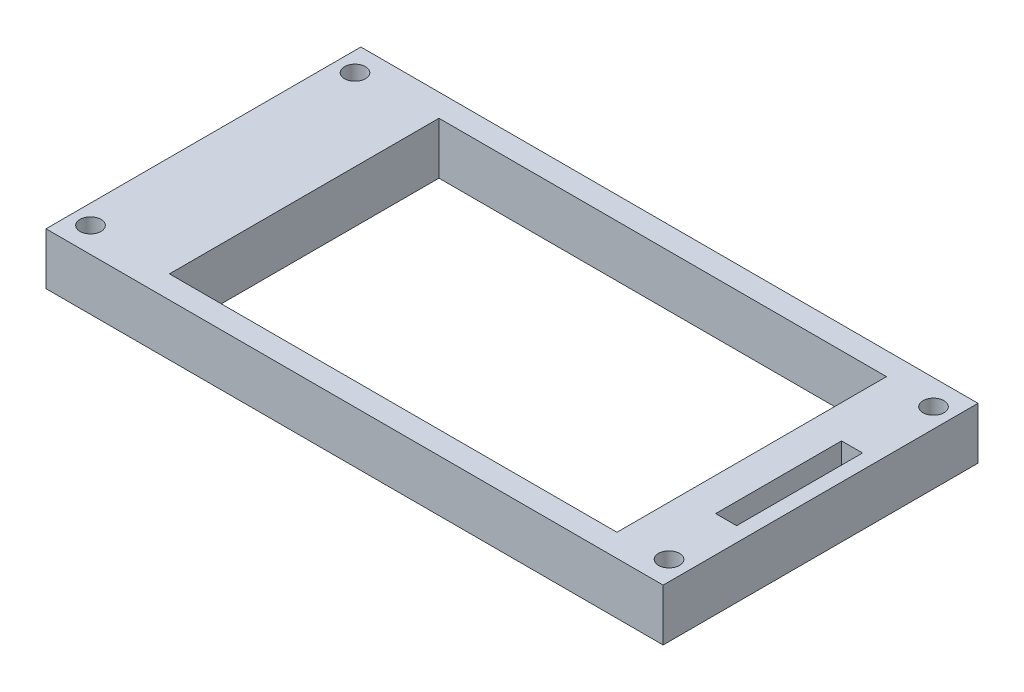
ISO-10303-21;
HEADER;
FILE_DESCRIPTION(('STEP AP214'),'2;1');
FILE_NAME('part.step','',(''),(''),'','','');
FILE_SCHEMA(('AUTOMOTIVE_DESIGN { 1 0 10303 214 1 1 1 1 }'));
ENDSEC;
DATA;
#1=APPLICATION_CONTEXT('core data for automotive mechanical design processes');
#2=APPLICATION_PROTOCOL_DEFINITION('international standard','automotive_design',2000,#1);
#3=PRODUCT_CONTEXT('',#1,'mechanical');
#4=PRODUCT('Part','Part','',(#3));
#5=PRODUCT_RELATED_PRODUCT_CATEGORY('part','',(#4));
#6=PRODUCT_DEFINITION_FORMATION('','',#4);
#7=PRODUCT_DEFINITION_CONTEXT('part definition',#1,'design');
#8=PRODUCT_DEFINITION('design','',#6,#7);
#9=PRODUCT_DEFINITION_SHAPE('','',#8);
#10=(LENGTH_UNIT() NAMED_UNIT(*) SI_UNIT(.MILLI.,.METRE.));
#11=(NAMED_UNIT(*) PLANE_ANGLE_UNIT() SI_UNIT($,.RADIAN.));
#12=(NAMED_UNIT(*) SI_UNIT($,.STERADIAN.) SOLID_ANGLE_UNIT());
#13=UNCERTAINTY_MEASURE_WITH_UNIT(LENGTH_MEASURE(1.E-05),#10,'distance_accuracy_value','');
#14=(GEOMETRIC_REPRESENTATION_CONTEXT(3) GLOBAL_UNCERTAINTY_ASSIGNED_CONTEXT((#13)) GLOBAL_UNIT_ASSIGNED_CONTEXT((#10,
#11,#12)) REPRESENTATION_CONTEXT('',''));
#15=CARTESIAN_POINT('',(0.,0.,0.));
#16=DIRECTION('',(0.,0.,1.));
#17=DIRECTION('',(1.,0.,0.));
#18=AXIS2_PLACEMENT_3D('',#15,#16,#17);
#19=CARTESIAN_POINT('',(0.,6.18,12.));
#20=DIRECTION('',(0.,0.,-1.));
#21=DIRECTION('',(-1.,0.,0.));
#22=AXIS2_PLACEMENT_3D('',#19,#20,#21);
#23=PLANE('',#22);
#24=DIRECTION('',(1.,0.,0.));
#25=VECTOR('',#24,1.);
#26=CARTESIAN_POINT('',(0.,0.,12.));
#27=LINE('',#26,#25);
#28=CARTESIAN_POINT('',(69.25,0.,12.));
#29=VERTEX_POINT('',#28);
#30=CARTESIAN_POINT('',(71.75,0.,12.));
#31=VERTEX_POINT('',#30);
#32=EDGE_CURVE('E194',#29,#31,#27,.T.);
#33=ORIENTED_EDGE('',*,*,#32,.T.);
#34=DIRECTION('',(0.,-1.,0.));
#35=VECTOR('',#34,1.);
#36=CARTESIAN_POINT('',(71.75,6.18,12.));
#37=LINE('',#36,#35);
#38=CARTESIAN_POINT('',(71.75,6.18,12.));
#39=VERTEX_POINT('',#38);
#40=EDGE_CURVE('E11',#39,#31,#37,.T.);
#41=ORIENTED_EDGE('',*,*,#40,.F.);
#42=DIRECTION('',(1.,0.,0.));
#43=VECTOR('',#42,1.);
#44=CARTESIAN_POINT('',(0.,6.18,12.));
#45=LINE('',#44,#43);
#46=CARTESIAN_POINT('',(69.25,6.18,12.));
#47=VERTEX_POINT('',#46);
#48=EDGE_CURVE('E142',#47,#39,#45,.T.);
#49=ORIENTED_EDGE('',*,*,#48,.F.);
#50=DIRECTION('',(0.,-1.,0.));
#51=VECTOR('',#50,1.);
#52=CARTESIAN_POINT('',(69.25,6.18,12.));
#53=LINE('',#52,#51);
#54=EDGE_CURVE('E57',#47,#29,#53,.T.);
#55=ORIENTED_EDGE('',*,*,#54,.T.);
#56=EDGE_LOOP('',(#33,#41,#49,#55));
#57=FACE_BOUND('',#56,.T.);
#58=ADVANCED_FACE('F38',(#57),#23,.F.);
#59=CARTESIAN_POINT('',(71.75,6.18,0.));
#60=DIRECTION('',(1.,0.,0.));
#61=DIRECTION('',(0.,0.,-1.));
#62=AXIS2_PLACEMENT_3D('',#59,#60,#61);
#63=PLANE('',#62);
#64=DIRECTION('',(0.,0.,1.));
#65=VECTOR('',#64,1.);
#66=CARTESIAN_POINT('',(71.75,0.,0.));
#67=LINE('',#66,#65);
#68=CARTESIAN_POINT('',(71.75,0.,27.));
#69=VERTEX_POINT('',#68);
#70=EDGE_CURVE('E148',#31,#69,#67,.T.);
#71=ORIENTED_EDGE('',*,*,#70,.T.);
#72=DIRECTION('',(0.,-1.,0.));
#73=VECTOR('',#72,1.);
#74=CARTESIAN_POINT('',(71.75,6.18,27.));
#75=LINE('',#74,#73);
#76=CARTESIAN_POINT('',(71.75,6.18,27.));
#77=VERTEX_POINT('',#76);
#78=EDGE_CURVE('E48',#77,#69,#75,.T.);
#79=ORIENTED_EDGE('',*,*,#78,.F.);
#80=DIRECTION('',(0.,0.,1.));
#81=VECTOR('',#80,1.);
#82=CARTESIAN_POINT('',(71.75,6.18,0.));
#83=LINE('',#82,#81);
#84=EDGE_CURVE('E136',#39,#77,#83,.T.);
#85=ORIENTED_EDGE('',*,*,#84,.F.);
#86=ORIENTED_EDGE('',*,*,#40,.T.);
#87=EDGE_LOOP('',(#71,#79,#85,#86));
#88=FACE_BOUND('',#87,.T.);
#89=ADVANCED_FACE('F147',(#88),#63,.F.);
#90=CARTESIAN_POINT('',(0.,6.18,27.));
#91=DIRECTION('',(0.,0.,-1.));
#92=DIRECTION('',(-1.,0.,0.));
#93=AXIS2_PLACEMENT_3D('',#90,#91,#92);
#94=PLANE('',#93);
#95=DIRECTION('',(1.,0.,0.));
#96=VECTOR('',#95,1.);
#97=CARTESIAN_POINT('',(0.,0.,27.));
#98=LINE('',#97,#96);
#99=CARTESIAN_POINT('',(69.25,0.,27.));
#100=VERTEX_POINT('',#99);
#101=EDGE_CURVE('E197',#100,#69,#98,.T.);
#102=ORIENTED_EDGE('',*,*,#101,.F.);
#103=DIRECTION('',(0.,-1.,0.));
#104=VECTOR('',#103,1.);
#105=CARTESIAN_POINT('',(69.25,6.18,27.));
#106=LINE('',#105,#104);
#107=CARTESIAN_POINT('',(69.25,6.18,27.));
#108=VERTEX_POINT('',#107);
#109=EDGE_CURVE('E95',#108,#100,#106,.T.);
#110=ORIENTED_EDGE('',*,*,#109,.F.);
#111=DIRECTION('',(1.,0.,0.));
#112=VECTOR('',#111,1.);
#113=CARTESIAN_POINT('',(0.,6.18,27.));
#114=LINE('',#113,#112);
#115=EDGE_CURVE('E141',#108,#77,#114,.T.);
#116=ORIENTED_EDGE('',*,*,#115,.T.);
#117=ORIENTED_EDGE('',*,*,#78,.T.);
#118=EDGE_LOOP('',(#102,#110,#116,#117));
#119=FACE_BOUND('',#118,.T.);
#120=ADVANCED_FACE('F152',(#119),#94,.T.);
#121=CARTESIAN_POINT('',(0.,6.18,2.7));
#122=DIRECTION('',(0.,0.,-1.));
#123=DIRECTION('',(-1.,0.,0.));
#124=AXIS2_PLACEMENT_3D('',#121,#122,#123);
#125=PLANE('',#124);
#126=DIRECTION('',(1.,0.,0.));
#127=VECTOR('',#126,1.);
#128=CARTESIAN_POINT('',(0.,0.,2.7));
#129=LINE('',#128,#127);
#130=CARTESIAN_POINT('',(12.,0.,2.7));
#131=VERTEX_POINT('',#130);
#132=CARTESIAN_POINT('',(65.3,0.,2.7));
#133=VERTEX_POINT('',#132);
#134=EDGE_CURVE('E176',#131,#133,#129,.T.);
#135=ORIENTED_EDGE('',*,*,#134,.T.);
#136=DIRECTION('',(0.,-1.,0.));
#137=VECTOR('',#136,1.);
#138=CARTESIAN_POINT('',(65.3,6.18,2.7));
#139=LINE('',#138,#137);
#140=CARTESIAN_POINT('',(65.3,6.18,2.7));
#141=VERTEX_POINT('',#140);
#142=EDGE_CURVE('E204',#141,#133,#139,.T.);
#143=ORIENTED_EDGE('',*,*,#142,.F.);
#144=DIRECTION('',(1.,0.,0.));
#145=VECTOR('',#144,1.);
#146=CARTESIAN_POINT('',(0.,6.18,2.7));
#147=LINE('',#146,#145);
#148=CARTESIAN_POINT('',(12.,6.18,2.7));
#149=VERTEX_POINT('',#148);
#150=EDGE_CURVE('E241',#149,#141,#147,.T.);
#151=ORIENTED_EDGE('',*,*,#150,.F.);
#152=DIRECTION('',(0.,-1.,0.));
#153=VECTOR('',#152,1.);
#154=CARTESIAN_POINT('',(12.,6.18,2.7));
#155=LINE('',#154,#153);
#156=EDGE_CURVE('E206',#149,#131,#155,.T.);
#157=ORIENTED_EDGE('',*,*,#156,.T.);
#158=EDGE_LOOP('',(#135,#143,#151,#157));
#159=FACE_BOUND('',#158,.T.);
#160=ADVANCED_FACE('F306',(#159),#125,.F.);
#161=CARTESIAN_POINT('',(65.3,6.18,0.));
#162=DIRECTION('',(1.,0.,0.));
#163=DIRECTION('',(0.,0.,-1.));
#164=AXIS2_PLACEMENT_3D('',#161,#162,#163);
#165=PLANE('',#164);
#166=DIRECTION('',(0.,0.,1.));
#167=VECTOR('',#166,1.);
#168=CARTESIAN_POINT('',(65.3,0.,0.));
#169=LINE('',#168,#167);
#170=CARTESIAN_POINT('',(65.3,0.,34.8));
#171=VERTEX_POINT('',#170);
#172=EDGE_CURVE('E179',#133,#171,#169,.T.);
#173=ORIENTED_EDGE('',*,*,#172,.T.);
#174=DIRECTION('',(0.,-1.,0.));
#175=VECTOR('',#174,1.);
#176=CARTESIAN_POINT('',(65.3,6.18,34.8));
#177=LINE('',#176,#175);
#178=CARTESIAN_POINT('',(65.3,6.18,34.8));
#179=VERTEX_POINT('',#178);
#180=EDGE_CURVE('E210',#179,#171,#177,.T.);
#181=ORIENTED_EDGE('',*,*,#180,.F.);
#182=DIRECTION('',(0.,0.,1.));
#183=VECTOR('',#182,1.);
#184=CARTESIAN_POINT('',(65.3,6.18,0.));
#185=LINE('',#184,#183);
#186=EDGE_CURVE('E250',#141,#179,#185,.T.);
#187=ORIENTED_EDGE('',*,*,#186,.F.);
#188=ORIENTED_EDGE('',*,*,#142,.T.);
#189=EDGE_LOOP('',(#173,#181,#187,#188));
#190=FACE_BOUND('',#189,.T.);
#191=ADVANCED_FACE('F302',(#190),#165,.F.);
#192=CARTESIAN_POINT('',(0.,6.18,34.8));
#193=DIRECTION('',(0.,0.,-1.));
#194=DIRECTION('',(-1.,0.,0.));
#195=AXIS2_PLACEMENT_3D('',#192,#193,#194);
#196=PLANE('',#195);
#197=DIRECTION('',(1.,0.,0.));
#198=VECTOR('',#197,1.);
#199=CARTESIAN_POINT('',(0.,0.,34.8));
#200=LINE('',#199,#198);
#201=CARTESIAN_POINT('',(12.,0.,34.8));
#202=VERTEX_POINT('',#201);
#203=EDGE_CURVE('E182',#202,#171,#200,.T.);
#204=ORIENTED_EDGE('',*,*,#203,.F.);
#205=DIRECTION('',(0.,-1.,0.));
#206=VECTOR('',#205,1.);
#207=CARTESIAN_POINT('',(12.,6.18,34.8));
#208=LINE('',#207,#206);
#209=CARTESIAN_POINT('',(12.,6.18,34.8));
#210=VERTEX_POINT('',#209);
#211=EDGE_CURVE('E208',#210,#202,#208,.T.);
#212=ORIENTED_EDGE('',*,*,#211,.F.);
#213=DIRECTION('',(1.,0.,0.));
#214=VECTOR('',#213,1.);
#215=CARTESIAN_POINT('',(0.,6.18,34.8));
#216=LINE('',#215,#214);
#217=EDGE_CURVE('E252',#210,#179,#216,.T.);
#218=ORIENTED_EDGE('',*,*,#217,.T.);
#219=ORIENTED_EDGE('',*,*,#180,.T.);
#220=EDGE_LOOP('',(#204,#212,#218,#219));
#221=FACE_BOUND('',#220,.T.);
#222=ADVANCED_FACE('F299',(#221),#196,.T.);
#223=CARTESIAN_POINT('',(0.,6.18,37.5));
#224=DIRECTION('',(0.,0.,-1.));
#225=DIRECTION('',(-1.,0.,0.));
#226=AXIS2_PLACEMENT_3D('',#223,#224,#225);
#227=PLANE('',#226);
#228=DIRECTION('',(1.,0.,0.));
#229=VECTOR('',#228,1.);
#230=CARTESIAN_POINT('',(0.,0.,37.5));
#231=LINE('',#230,#229);
#232=CARTESIAN_POINT('',(0.,0.,37.5));
#233=VERTEX_POINT('',#232);
#234=CARTESIAN_POINT('',(73.5,0.,37.5));
#235=VERTEX_POINT('',#234);
#236=EDGE_CURVE('E165',#233,#235,#231,.T.);
#237=ORIENTED_EDGE('',*,*,#236,.T.);
#238=DIRECTION('',(0.,-1.,0.));
#239=VECTOR('',#238,1.);
#240=CARTESIAN_POINT('',(73.5,6.18,37.5));
#241=LINE('',#240,#239);
#242=CARTESIAN_POINT('',(73.5,6.18,37.5));
#243=VERTEX_POINT('',#242);
#244=EDGE_CURVE('E42',#243,#235,#241,.T.);
#245=ORIENTED_EDGE('',*,*,#244,.F.);
#246=DIRECTION('',(1.,0.,0.));
#247=VECTOR('',#246,1.);
#248=CARTESIAN_POINT('',(0.,6.18,37.5));
#249=LINE('',#248,#247);
#250=CARTESIAN_POINT('',(0.,6.18,37.5));
#251=VERTEX_POINT('',#250);
#252=EDGE_CURVE('E108',#251,#243,#249,.T.);
#253=ORIENTED_EDGE('',*,*,#252,.F.);
#254=DIRECTION('',(0.,-1.,0.));
#255=VECTOR('',#254,1.);
#256=CARTESIAN_POINT('',(0.,6.18,37.5));
#257=LINE('',#256,#255);
#258=EDGE_CURVE('E155',#251,#233,#257,.T.);
#259=ORIENTED_EDGE('',*,*,#258,.T.);
#260=EDGE_LOOP('',(#237,#245,#253,#259));
#261=FACE_BOUND('',#260,.T.);
#262=ADVANCED_FACE('F228',(#261),#227,.F.);
#263=CARTESIAN_POINT('',(73.5,6.18,0.));
#264=DIRECTION('',(1.,0.,0.));
#265=DIRECTION('',(0.,0.,-1.));
#266=AXIS2_PLACEMENT_3D('',#263,#264,#265);
#267=PLANE('',#266);
#268=DIRECTION('',(0.,0.,1.));
#269=VECTOR('',#268,1.);
#270=CARTESIAN_POINT('',(73.5,0.,0.));
#271=LINE('',#270,#269);
#272=CARTESIAN_POINT('',(73.5,0.,0.));
#273=VERTEX_POINT('',#272);
#274=EDGE_CURVE('E168',#273,#235,#271,.T.);
#275=ORIENTED_EDGE('',*,*,#274,.F.);
#276=DIRECTION('',(0.,-1.,0.));
#277=VECTOR('',#276,1.);
#278=CARTESIAN_POINT('',(73.5,6.18,0.));
#279=LINE('',#278,#277);
#280=CARTESIAN_POINT('',(73.5,6.18,0.));
#281=VERTEX_POINT('',#280);
#282=EDGE_CURVE('E217',#281,#273,#279,.T.);
#283=ORIENTED_EDGE('',*,*,#282,.F.);
#284=DIRECTION('',(0.,0.,1.));
#285=VECTOR('',#284,1.);
#286=CARTESIAN_POINT('',(73.5,6.18,0.));
#287=LINE('',#286,#285);
#288=EDGE_CURVE('E225',#281,#243,#287,.T.);
#289=ORIENTED_EDGE('',*,*,#288,.T.);
#290=ORIENTED_EDGE('',*,*,#244,.T.);
#291=EDGE_LOOP('',(#275,#283,#289,#290));
#292=FACE_BOUND('',#291,.T.);
#293=ADVANCED_FACE('F224',(#292),#267,.T.);
#294=CARTESIAN_POINT('',(0.,6.18,0.));
#295=DIRECTION('',(0.,0.,-1.));
#296=DIRECTION('',(-1.,0.,0.));
#297=AXIS2_PLACEMENT_3D('',#294,#295,#296);
#298=PLANE('',#297);
#299=DIRECTION('',(1.,0.,0.));
#300=VECTOR('',#299,1.);
#301=CARTESIAN_POINT('',(0.,0.,0.));
#302=LINE('',#301,#300);
#303=CARTESIAN_POINT('',(0.,0.,0.));
#304=VERTEX_POINT('',#303);
#305=EDGE_CURVE('E171',#304,#273,#302,.T.);
#306=ORIENTED_EDGE('',*,*,#305,.F.);
#307=DIRECTION('',(0.,-1.,0.));
#308=VECTOR('',#307,1.);
#309=CARTESIAN_POINT('',(0.,6.18,0.));
#310=LINE('',#309,#308);
#311=CARTESIAN_POINT('',(0.,6.18,0.));
#312=VERTEX_POINT('',#311);
#313=EDGE_CURVE('E216',#312,#304,#310,.T.);
#314=ORIENTED_EDGE('',*,*,#313,.F.);
#315=DIRECTION('',(1.,0.,0.));
#316=VECTOR('',#315,1.);
#317=CARTESIAN_POINT('',(0.,6.18,0.));
#318=LINE('',#317,#316);
#319=EDGE_CURVE('E237',#312,#281,#318,.T.);
#320=ORIENTED_EDGE('',*,*,#319,.T.);
#321=ORIENTED_EDGE('',*,*,#282,.T.);
#322=EDGE_LOOP('',(#306,#314,#320,#321));
#323=FACE_BOUND('',#322,.T.);
#324=ADVANCED_FACE('F234',(#323),#298,.T.);
#325=CARTESIAN_POINT('',(71.2,6.18,3.));
#326=DIRECTION('',(0.,-1.,0.));
#327=DIRECTION('',(0.,0.,-1.));
#328=AXIS2_PLACEMENT_3D('',#325,#326,#327);
#329=CYLINDRICAL_SURFACE('',#328,1.25);
#330=CARTESIAN_POINT('',(71.2,6.18,3.));
#331=DIRECTION('',(0.,1.,0.));
#332=DIRECTION('',(0.,0.,1.));
#333=AXIS2_PLACEMENT_3D('',#330,#331,#332);
#334=CIRCLE('',#333,1.25);
#335=CARTESIAN_POINT('',(71.2,6.18,4.25));
#336=VERTEX_POINT('',#335);
#337=EDGE_CURVE('E261',#336,#336,#334,.T.);
#338=ORIENTED_EDGE('',*,*,#337,.T.);
#339=EDGE_LOOP('',(#338));
#340=FACE_BOUND('',#339,.T.);
#341=CARTESIAN_POINT('',(71.2,0.,3.));
#342=DIRECTION('',(0.,1.,0.));
#343=DIRECTION('',(0.,0.,1.));
#344=AXIS2_PLACEMENT_3D('',#341,#342,#343);
#345=CIRCLE('',#344,1.25);
#346=CARTESIAN_POINT('',(71.2,0.,4.25));
#347=VERTEX_POINT('',#346);
#348=EDGE_CURVE('E191',#347,#347,#345,.T.);
#349=ORIENTED_EDGE('',*,*,#348,.F.);
#350=EDGE_LOOP('',(#349));
#351=FACE_BOUND('',#350,.T.);
#352=ADVANCED_FACE('F265',(#340,#351),#329,.F.);
#353=CARTESIAN_POINT('',(71.2,6.18,34.5));
#354=DIRECTION('',(0.,-1.,0.));
#355=DIRECTION('',(0.,0.,-1.));
#356=AXIS2_PLACEMENT_3D('',#353,#354,#355);
#357=CYLINDRICAL_SURFACE('',#356,1.25);
#358=CARTESIAN_POINT('',(71.2,6.18,34.5));
#359=DIRECTION('',(0.,1.,0.));
#360=DIRECTION('',(0.,0.,1.));
#361=AXIS2_PLACEMENT_3D('',#358,#359,#360);
#362=CIRCLE('',#361,1.25);
#363=CARTESIAN_POINT('',(71.2,6.18,35.75));
#364=VERTEX_POINT('',#363);
#365=EDGE_CURVE('E258',#364,#364,#362,.T.);
#366=ORIENTED_EDGE('',*,*,#365,.T.);
#367=EDGE_LOOP('',(#366));
#368=FACE_BOUND('',#367,.T.);
#369=CARTESIAN_POINT('',(71.2,0.,34.5));
#370=DIRECTION('',(0.,1.,0.));
#371=DIRECTION('',(0.,0.,1.));
#372=AXIS2_PLACEMENT_3D('',#369,#370,#371);
#373=CIRCLE('',#372,1.25);
#374=CARTESIAN_POINT('',(71.2,0.,35.75));
#375=VERTEX_POINT('',#374);
#376=EDGE_CURVE('E188',#375,#375,#373,.T.);
#377=ORIENTED_EDGE('',*,*,#376,.F.);
#378=EDGE_LOOP('',(#377));
#379=FACE_BOUND('',#378,.T.);
#380=ADVANCED_FACE('F291',(#368,#379),#357,.F.);
#381=CARTESIAN_POINT('',(12.,6.18,0.));
#382=DIRECTION('',(1.,0.,0.));
#383=DIRECTION('',(0.,0.,-1.));
#384=AXIS2_PLACEMENT_3D('',#381,#382,#383);
#385=PLANE('',#384);
#386=DIRECTION('',(0.,0.,1.));
#387=VECTOR('',#386,1.);
#388=CARTESIAN_POINT('',(12.,0.,0.));
#389=LINE('',#388,#387);
#390=EDGE_CURVE('E185',#131,#202,#389,.T.);
#391=ORIENTED_EDGE('',*,*,#390,.F.);
#392=ORIENTED_EDGE('',*,*,#156,.F.);
#393=DIRECTION('',(0.,0.,1.));
#394=VECTOR('',#393,1.);
#395=CARTESIAN_POINT('',(12.,6.18,0.));
#396=LINE('',#395,#394);
#397=EDGE_CURVE('E255',#149,#210,#396,.T.);
#398=ORIENTED_EDGE('',*,*,#397,.T.);
#399=ORIENTED_EDGE('',*,*,#211,.T.);
#400=EDGE_LOOP('',(#391,#392,#398,#399));
#401=FACE_BOUND('',#400,.T.);
#402=ADVANCED_FACE('F294',(#401),#385,.T.);
#403=CARTESIAN_POINT('',(0.,6.18,0.));
#404=DIRECTION('',(1.,0.,0.));
#405=DIRECTION('',(0.,0.,-1.));
#406=AXIS2_PLACEMENT_3D('',#403,#404,#405);
#407=PLANE('',#406);
#408=DIRECTION('',(0.,0.,1.));
#409=VECTOR('',#408,1.);
#410=CARTESIAN_POINT('',(0.,0.,0.));
#411=LINE('',#410,#409);
#412=EDGE_CURVE('E174',#304,#233,#411,.T.);
#413=ORIENTED_EDGE('',*,*,#412,.T.);
#414=ORIENTED_EDGE('',*,*,#258,.F.);
#415=DIRECTION('',(0.,0.,1.));
#416=VECTOR('',#415,1.);
#417=CARTESIAN_POINT('',(0.,6.18,0.));
#418=LINE('',#417,#416);
#419=EDGE_CURVE('E239',#312,#251,#418,.T.);
#420=ORIENTED_EDGE('',*,*,#419,.F.);
#421=ORIENTED_EDGE('',*,*,#313,.T.);
#422=EDGE_LOOP('',(#413,#414,#420,#421));
#423=FACE_BOUND('',#422,.T.);
#424=ADVANCED_FACE('F240',(#423),#407,.F.);
#425=CARTESIAN_POINT('',(2.3,6.18,3.));
#426=DIRECTION('',(0.,-1.,0.));
#427=DIRECTION('',(0.,0.,-1.));
#428=AXIS2_PLACEMENT_3D('',#425,#426,#427);
#429=CYLINDRICAL_SURFACE('',#428,1.25);
#430=CARTESIAN_POINT('',(2.3,6.18,3.));
#431=DIRECTION('',(0.,1.,0.));
#432=DIRECTION('',(0.,0.,1.));
#433=AXIS2_PLACEMENT_3D('',#430,#431,#432);
#434=CIRCLE('',#433,1.25);
#435=CARTESIAN_POINT('',(2.3,6.18,4.25));
#436=VERTEX_POINT('',#435);
#437=EDGE_CURVE('E328',#436,#436,#434,.T.);
#438=ORIENTED_EDGE('',*,*,#437,.T.);
#439=EDGE_LOOP('',(#438));
#440=FACE_BOUND('',#439,.T.);
#441=CARTESIAN_POINT('',(2.3,0.,3.));
#442=DIRECTION('',(0.,1.,0.));
#443=DIRECTION('',(0.,0.,1.));
#444=AXIS2_PLACEMENT_3D('',#441,#442,#443);
#445=CIRCLE('',#444,1.25);
#446=CARTESIAN_POINT('',(2.3,0.,4.25));
#447=VERTEX_POINT('',#446);
#448=EDGE_CURVE('E162',#447,#447,#445,.T.);
#449=ORIENTED_EDGE('',*,*,#448,.F.);
#450=EDGE_LOOP('',(#449));
#451=FACE_BOUND('',#450,.T.);
#452=ADVANCED_FACE('F313',(#440,#451),#429,.F.);
#453=CARTESIAN_POINT('',(2.3,6.18,34.5));
#454=DIRECTION('',(0.,-1.,0.));
#455=DIRECTION('',(0.,0.,-1.));
#456=AXIS2_PLACEMENT_3D('',#453,#454,#455);
#457=CYLINDRICAL_SURFACE('',#456,1.25);
#458=CARTESIAN_POINT('',(2.3,6.18,34.5));
#459=DIRECTION('',(0.,1.,0.));
#460=DIRECTION('',(0.,0.,1.));
#461=AXIS2_PLACEMENT_3D('',#458,#459,#460);
#462=CIRCLE('',#461,1.25);
#463=CARTESIAN_POINT('',(2.3,6.18,35.75));
#464=VERTEX_POINT('',#463);
#465=EDGE_CURVE('E202',#464,#464,#462,.T.);
#466=ORIENTED_EDGE('',*,*,#465,.T.);
#467=EDGE_LOOP('',(#466));
#468=FACE_BOUND('',#467,.T.);
#469=CARTESIAN_POINT('',(2.3,0.,34.5));
#470=DIRECTION('',(0.,1.,0.));
#471=DIRECTION('',(0.,0.,1.));
#472=AXIS2_PLACEMENT_3D('',#469,#470,#471);
#473=CIRCLE('',#472,1.25);
#474=CARTESIAN_POINT('',(2.3,0.,35.75));
#475=VERTEX_POINT('',#474);
#476=EDGE_CURVE('E159',#475,#475,#473,.T.);
#477=ORIENTED_EDGE('',*,*,#476,.F.);
#478=EDGE_LOOP('',(#477));
#479=FACE_BOUND('',#478,.T.);
#480=ADVANCED_FACE('F40',(#468,#479),#457,.F.);
#481=CARTESIAN_POINT('',(69.25,6.18,0.));
#482=DIRECTION('',(1.,0.,0.));
#483=DIRECTION('',(0.,0.,-1.));
#484=AXIS2_PLACEMENT_3D('',#481,#482,#483);
#485=PLANE('',#484);
#486=DIRECTION('',(0.,0.,1.));
#487=VECTOR('',#486,1.);
#488=CARTESIAN_POINT('',(69.25,0.,0.));
#489=LINE('',#488,#487);
#490=EDGE_CURVE('E199',#29,#100,#489,.T.);
#491=ORIENTED_EDGE('',*,*,#490,.F.);
#492=ORIENTED_EDGE('',*,*,#54,.F.);
#493=DIRECTION('',(0.,0.,1.));
#494=VECTOR('',#493,1.);
#495=CARTESIAN_POINT('',(69.25,6.18,0.));
#496=LINE('',#495,#494);
#497=EDGE_CURVE('E153',#47,#108,#496,.T.);
#498=ORIENTED_EDGE('',*,*,#497,.T.);
#499=ORIENTED_EDGE('',*,*,#109,.T.);
#500=EDGE_LOOP('',(#491,#492,#498,#499));
#501=FACE_BOUND('',#500,.T.);
#502=ADVANCED_FACE('F269',(#501),#485,.T.);
#503=CARTESIAN_POINT('',(0.,6.18,0.));
#504=DIRECTION('',(0.,1.,0.));
#505=DIRECTION('',(0.,0.,1.));
#506=AXIS2_PLACEMENT_3D('',#503,#504,#505);
#507=PLANE('',#506);
#508=ORIENTED_EDGE('',*,*,#465,.F.);
#509=EDGE_LOOP('',(#508));
#510=FACE_BOUND('',#509,.T.);
#511=ORIENTED_EDGE('',*,*,#437,.F.);
#512=EDGE_LOOP('',(#511));
#513=FACE_BOUND('',#512,.T.);
#514=ORIENTED_EDGE('',*,*,#252,.T.);
#515=ORIENTED_EDGE('',*,*,#288,.F.);
#516=ORIENTED_EDGE('',*,*,#319,.F.);
#517=ORIENTED_EDGE('',*,*,#419,.T.);
#518=EDGE_LOOP('',(#514,#515,#516,#517));
#519=FACE_BOUND('',#518,.T.);
#520=ORIENTED_EDGE('',*,*,#150,.T.);
#521=ORIENTED_EDGE('',*,*,#186,.T.);
#522=ORIENTED_EDGE('',*,*,#217,.F.);
#523=ORIENTED_EDGE('',*,*,#397,.F.);
#524=EDGE_LOOP('',(#520,#521,#522,#523));
#525=FACE_BOUND('',#524,.T.);
#526=ORIENTED_EDGE('',*,*,#365,.F.);
#527=EDGE_LOOP('',(#526));
#528=FACE_BOUND('',#527,.T.);
#529=ORIENTED_EDGE('',*,*,#337,.F.);
#530=EDGE_LOOP('',(#529));
#531=FACE_BOUND('',#530,.T.);
#532=ORIENTED_EDGE('',*,*,#48,.T.);
#533=ORIENTED_EDGE('',*,*,#84,.T.);
#534=ORIENTED_EDGE('',*,*,#115,.F.);
#535=ORIENTED_EDGE('',*,*,#497,.F.);
#536=EDGE_LOOP('',(#532,#533,#534,#535));
#537=FACE_BOUND('',#536,.T.);
#538=ADVANCED_FACE('F138',(#510,#513,#519,#525,#528,#531,#537),#507,.T.);
#539=CARTESIAN_POINT('',(0.,0.,0.));
#540=DIRECTION('',(0.,1.,0.));
#541=DIRECTION('',(0.,0.,1.));
#542=AXIS2_PLACEMENT_3D('',#539,#540,#541);
#543=PLANE('',#542);
#544=ORIENTED_EDGE('',*,*,#476,.T.);
#545=EDGE_LOOP('',(#544));
#546=FACE_BOUND('',#545,.T.);
#547=ORIENTED_EDGE('',*,*,#448,.T.);
#548=EDGE_LOOP('',(#547));
#549=FACE_BOUND('',#548,.T.);
#550=ORIENTED_EDGE('',*,*,#236,.F.);
#551=ORIENTED_EDGE('',*,*,#412,.F.);
#552=ORIENTED_EDGE('',*,*,#305,.T.);
#553=ORIENTED_EDGE('',*,*,#274,.T.);
#554=EDGE_LOOP('',(#550,#551,#552,#553));
#555=FACE_BOUND('',#554,.T.);
#556=ORIENTED_EDGE('',*,*,#134,.F.);
#557=ORIENTED_EDGE('',*,*,#390,.T.);
#558=ORIENTED_EDGE('',*,*,#203,.T.);
#559=ORIENTED_EDGE('',*,*,#172,.F.);
#560=EDGE_LOOP('',(#556,#557,#558,#559));
#561=FACE_BOUND('',#560,.T.);
#562=ORIENTED_EDGE('',*,*,#376,.T.);
#563=EDGE_LOOP('',(#562));
#564=FACE_BOUND('',#563,.T.);
#565=ORIENTED_EDGE('',*,*,#348,.T.);
#566=EDGE_LOOP('',(#565));
#567=FACE_BOUND('',#566,.T.);
#568=ORIENTED_EDGE('',*,*,#32,.F.);
#569=ORIENTED_EDGE('',*,*,#490,.T.);
#570=ORIENTED_EDGE('',*,*,#101,.T.);
#571=ORIENTED_EDGE('',*,*,#70,.F.);
#572=EDGE_LOOP('',(#568,#569,#570,#571));
#573=FACE_BOUND('',#572,.T.);
#574=ADVANCED_FACE('F232',(#546,#549,#555,#561,#564,#567,#573),#543,.F.);
#575=CLOSED_SHELL('',(#58,#89,#120,#160,#191,#222,#262,#293,#324,#352,#380,#402,#424,#452,#480,
#502,#538,#574));
#576=MANIFOLD_SOLID_BREP('B2',#575);
#577=ADVANCED_BREP_SHAPE_REPRESENTATION('',(#18,#576),#14);
#578=SHAPE_DEFINITION_REPRESENTATION(#9,#577);
ENDSEC;
END-ISO-10303-21;
